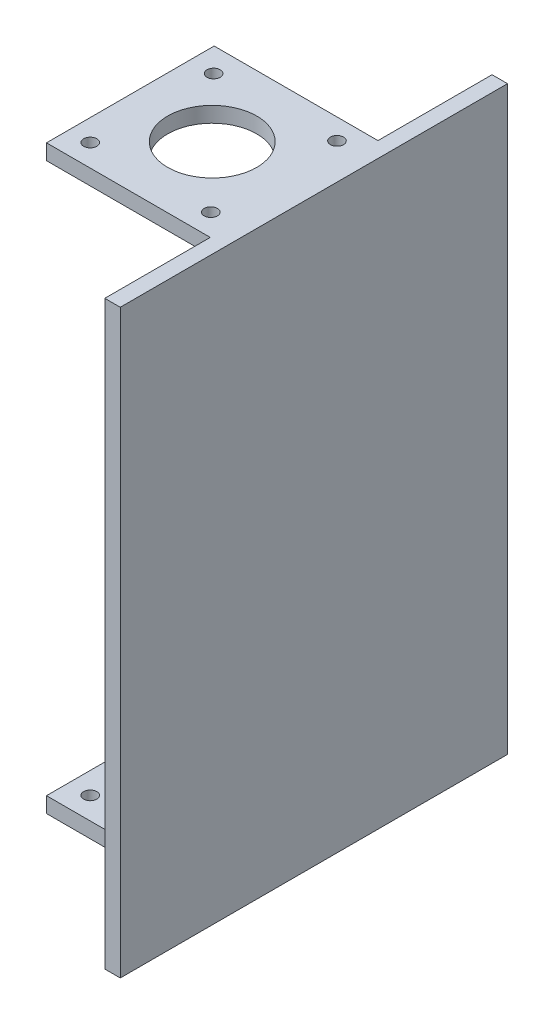
ISO-10303-21;
HEADER;
FILE_DESCRIPTION(('STEP AP214'),'2;1');
FILE_NAME('part.step','',(''),(''),'','','');
FILE_SCHEMA(('AUTOMOTIVE_DESIGN { 1 0 10303 214 1 1 1 1 }'));
ENDSEC;
DATA;
#1=APPLICATION_CONTEXT('core data for automotive mechanical design processes');
#2=APPLICATION_PROTOCOL_DEFINITION('international standard','automotive_design',2000,#1);
#3=PRODUCT_CONTEXT('',#1,'mechanical');
#4=PRODUCT('Part','Part','',(#3));
#5=PRODUCT_RELATED_PRODUCT_CATEGORY('part','',(#4));
#6=PRODUCT_DEFINITION_FORMATION('','',#4);
#7=PRODUCT_DEFINITION_CONTEXT('part definition',#1,'design');
#8=PRODUCT_DEFINITION('design','',#6,#7);
#9=PRODUCT_DEFINITION_SHAPE('','',#8);
#10=(LENGTH_UNIT() NAMED_UNIT(*) SI_UNIT(.MILLI.,.METRE.));
#11=(NAMED_UNIT(*) PLANE_ANGLE_UNIT() SI_UNIT($,.RADIAN.));
#12=(NAMED_UNIT(*) SI_UNIT($,.STERADIAN.) SOLID_ANGLE_UNIT());
#13=UNCERTAINTY_MEASURE_WITH_UNIT(LENGTH_MEASURE(1.E-05),#10,'distance_accuracy_value','');
#14=(GEOMETRIC_REPRESENTATION_CONTEXT(3) GLOBAL_UNCERTAINTY_ASSIGNED_CONTEXT((#13)) GLOBAL_UNIT_ASSIGNED_CONTEXT((#10,
#11,#12)) REPRESENTATION_CONTEXT('',''));
#15=CARTESIAN_POINT('',(0.,0.,0.));
#16=DIRECTION('',(0.,0.,1.));
#17=DIRECTION('',(1.,0.,0.));
#18=AXIS2_PLACEMENT_3D('',#15,#16,#17);
#19=CARTESIAN_POINT('',(21.15,0.,0.));
#20=DIRECTION('',(1.,0.,0.));
#21=DIRECTION('',(0.,0.,-1.));
#22=AXIS2_PLACEMENT_3D('',#19,#20,#21);
#23=PLANE('',#22);
#24=DIRECTION('',(0.,1.,0.));
#25=VECTOR('',#24,1.);
#26=CARTESIAN_POINT('',(21.15,-146.,21.65));
#27=LINE('',#26,#25);
#28=CARTESIAN_POINT('',(21.15,-146.,21.65));
#29=VERTEX_POINT('',#28);
#30=CARTESIAN_POINT('',(21.15,-142.,21.65));
#31=VERTEX_POINT('',#30);
#32=EDGE_CURVE('E146',#29,#31,#27,.T.);
#33=ORIENTED_EDGE('',*,*,#32,.F.);
#34=DIRECTION('',(0.,0.,-1.));
#35=VECTOR('',#34,1.);
#36=CARTESIAN_POINT('',(21.15,-146.,48.8941402757908));
#37=LINE('',#36,#35);
#38=CARTESIAN_POINT('',(21.15,-146.,48.8941402757908));
#39=VERTEX_POINT('',#38);
#40=EDGE_CURVE('E161',#39,#29,#37,.T.);
#41=ORIENTED_EDGE('',*,*,#40,.F.);
#42=DIRECTION('',(0.,-1.,0.));
#43=VECTOR('',#42,1.);
#44=CARTESIAN_POINT('',(21.15,4.,48.8941402757908));
#45=LINE('',#44,#43);
#46=CARTESIAN_POINT('',(21.15,4.,48.8941402757908));
#47=VERTEX_POINT('',#46);
#48=EDGE_CURVE('E167',#47,#39,#45,.T.);
#49=ORIENTED_EDGE('',*,*,#48,.F.);
#50=DIRECTION('',(0.,0.,1.));
#51=VECTOR('',#50,1.);
#52=CARTESIAN_POINT('',(21.15,4.,48.8941402757908));
#53=LINE('',#52,#51);
#54=CARTESIAN_POINT('',(21.15,4.,21.65));
#55=VERTEX_POINT('',#54);
#56=EDGE_CURVE('E177',#55,#47,#53,.T.);
#57=ORIENTED_EDGE('',*,*,#56,.F.);
#58=DIRECTION('',(0.,-1.,0.));
#59=VECTOR('',#58,1.);
#60=CARTESIAN_POINT('',(21.15,4.,21.65));
#61=LINE('',#60,#59);
#62=CARTESIAN_POINT('',(21.15,0.,21.65));
#63=VERTEX_POINT('',#62);
#64=EDGE_CURVE('E251',#55,#63,#61,.T.);
#65=ORIENTED_EDGE('',*,*,#64,.T.);
#66=DIRECTION('',(0.,0.,-1.));
#67=VECTOR('',#66,1.);
#68=CARTESIAN_POINT('',(21.15,0.,21.65));
#69=LINE('',#68,#67);
#70=CARTESIAN_POINT('',(21.15,0.,-21.65));
#71=VERTEX_POINT('',#70);
#72=EDGE_CURVE('E241',#63,#71,#69,.T.);
#73=ORIENTED_EDGE('',*,*,#72,.T.);
#74=DIRECTION('',(0.,-1.,0.));
#75=VECTOR('',#74,1.);
#76=CARTESIAN_POINT('',(21.15,4.,-21.65));
#77=LINE('',#76,#75);
#78=CARTESIAN_POINT('',(21.15,4.,-21.65));
#79=VERTEX_POINT('',#78);
#80=EDGE_CURVE('E11',#79,#71,#77,.T.);
#81=ORIENTED_EDGE('',*,*,#80,.F.);
#82=CARTESIAN_POINT('',(21.15,4.,-51.1058597242092));
#83=VERTEX_POINT('',#82);
#84=EDGE_CURVE('E184',#83,#79,#53,.T.);
#85=ORIENTED_EDGE('',*,*,#84,.F.);
#86=DIRECTION('',(0.,1.,0.));
#87=VECTOR('',#86,1.);
#88=CARTESIAN_POINT('',(21.15,4.,-51.1058597242092));
#89=LINE('',#88,#87);
#90=CARTESIAN_POINT('',(21.15,-146.,-51.1058597242093));
#91=VERTEX_POINT('',#90);
#92=EDGE_CURVE('E173',#91,#83,#89,.T.);
#93=ORIENTED_EDGE('',*,*,#92,.F.);
#94=CARTESIAN_POINT('',(21.15,-146.,-21.65));
#95=VERTEX_POINT('',#94);
#96=EDGE_CURVE('E175',#95,#91,#37,.T.);
#97=ORIENTED_EDGE('',*,*,#96,.F.);
#98=DIRECTION('',(0.,1.,0.));
#99=VECTOR('',#98,1.);
#100=CARTESIAN_POINT('',(21.15,-146.,-21.65));
#101=LINE('',#100,#99);
#102=CARTESIAN_POINT('',(21.15,-142.,-21.65));
#103=VERTEX_POINT('',#102);
#104=EDGE_CURVE('E300',#95,#103,#101,.T.);
#105=ORIENTED_EDGE('',*,*,#104,.T.);
#106=DIRECTION('',(0.,0.,-1.));
#107=VECTOR('',#106,1.);
#108=CARTESIAN_POINT('',(21.15,-142.,21.65));
#109=LINE('',#108,#107);
#110=EDGE_CURVE('E163',#31,#103,#109,.T.);
#111=ORIENTED_EDGE('',*,*,#110,.F.);
#112=EDGE_LOOP('',(#33,#41,#49,#57,#65,#73,#81,#85,#93,#97,#105,#111));
#113=FACE_BOUND('',#112,.T.);
#114=ADVANCED_FACE('F44',(#113),#23,.F.);
#115=CARTESIAN_POINT('',(0.,4.,0.));
#116=DIRECTION('',(0.,-1.,0.));
#117=DIRECTION('',(0.,0.,-1.));
#118=AXIS2_PLACEMENT_3D('',#115,#116,#117);
#119=PLANE('',#118);
#120=DIRECTION('',(1.,0.,0.));
#121=VECTOR('',#120,1.);
#122=CARTESIAN_POINT('',(-21.15,4.,21.65));
#123=LINE('',#122,#121);
#124=CARTESIAN_POINT('',(-21.15,4.,21.65));
#125=VERTEX_POINT('',#124);
#126=EDGE_CURVE('E69',#125,#55,#123,.T.);
#127=ORIENTED_EDGE('',*,*,#126,.T.);
#128=ORIENTED_EDGE('',*,*,#56,.T.);
#129=DIRECTION('',(-1.,0.,0.));
#130=VECTOR('',#129,1.);
#131=CARTESIAN_POINT('',(25.15,4.,48.8941402757908));
#132=LINE('',#131,#130);
#133=CARTESIAN_POINT('',(25.15,4.,48.8941402757908));
#134=VERTEX_POINT('',#133);
#135=EDGE_CURVE('E188',#134,#47,#132,.T.);
#136=ORIENTED_EDGE('',*,*,#135,.F.);
#137=DIRECTION('',(0.,0.,1.));
#138=VECTOR('',#137,1.);
#139=CARTESIAN_POINT('',(25.15,4.,48.8941402757908));
#140=LINE('',#139,#138);
#141=CARTESIAN_POINT('',(25.15,4.,-51.1058597242092));
#142=VERTEX_POINT('',#141);
#143=EDGE_CURVE('E192',#142,#134,#140,.T.);
#144=ORIENTED_EDGE('',*,*,#143,.F.);
#145=DIRECTION('',(-1.,0.,0.));
#146=VECTOR('',#145,1.);
#147=CARTESIAN_POINT('',(25.15,4.,-51.1058597242092));
#148=LINE('',#147,#146);
#149=EDGE_CURVE('E191',#142,#83,#148,.T.);
#150=ORIENTED_EDGE('',*,*,#149,.T.);
#151=ORIENTED_EDGE('',*,*,#84,.T.);
#152=DIRECTION('',(-1.,0.,0.));
#153=VECTOR('',#152,1.);
#154=CARTESIAN_POINT('',(-21.15,4.,-21.65));
#155=LINE('',#154,#153);
#156=CARTESIAN_POINT('',(-21.15,4.,-21.65));
#157=VERTEX_POINT('',#156);
#158=EDGE_CURVE('E96',#79,#157,#155,.T.);
#159=ORIENTED_EDGE('',*,*,#158,.T.);
#160=DIRECTION('',(0.,0.,1.));
#161=VECTOR('',#160,1.);
#162=CARTESIAN_POINT('',(-21.15,4.,21.65));
#163=LINE('',#162,#161);
#164=EDGE_CURVE('E250',#157,#125,#163,.T.);
#165=ORIENTED_EDGE('',*,*,#164,.T.);
#166=EDGE_LOOP('',(#127,#128,#136,#144,#150,#151,#159,#165));
#167=FACE_BOUND('',#166,.T.);
#168=CARTESIAN_POINT('',(-15.0693743627521,4.,-15.4256243476872));
#169=DIRECTION('',(0.,1.,0.));
#170=DIRECTION('',(0.,0.,1.));
#171=AXIS2_PLACEMENT_3D('',#168,#169,#170);
#172=CIRCLE('',#171,1.7);
#173=CARTESIAN_POINT('',(-15.0693743627521,4.,-13.7256243476872));
#174=VERTEX_POINT('',#173);
#175=EDGE_CURVE('E240',#174,#174,#172,.T.);
#176=ORIENTED_EDGE('',*,*,#175,.F.);
#177=EDGE_LOOP('',(#176));
#178=FACE_BOUND('',#177,.T.);
#179=CARTESIAN_POINT('',(15.9184393720292,4.,-16.2947618158124));
#180=DIRECTION('',(0.,1.,0.));
#181=DIRECTION('',(0.,0.,1.));
#182=AXIS2_PLACEMENT_3D('',#179,#180,#181);
#183=CIRCLE('',#182,1.7);
#184=CARTESIAN_POINT('',(15.9184393720292,4.,-14.5947618158124));
#185=VERTEX_POINT('',#184);
#186=EDGE_CURVE('E228',#185,#185,#183,.T.);
#187=ORIENTED_EDGE('',*,*,#186,.F.);
#188=EDGE_LOOP('',(#187));
#189=FACE_BOUND('',#188,.T.);
#190=CARTESIAN_POINT('',(15.5663856712265,4.,15.9343853324848));
#191=DIRECTION('',(0.,1.,0.));
#192=DIRECTION('',(0.,0.,1.));
#193=AXIS2_PLACEMENT_3D('',#190,#191,#192);
#194=CIRCLE('',#193,1.7);
#195=CARTESIAN_POINT('',(15.5663856712265,4.,17.6343853324848));
#196=VERTEX_POINT('',#195);
#197=EDGE_CURVE('E222',#196,#196,#194,.T.);
#198=ORIENTED_EDGE('',*,*,#197,.F.);
#199=EDGE_LOOP('',(#198));
#200=FACE_BOUND('',#199,.T.);
#201=CARTESIAN_POINT('',(-15.5663856712265,4.,15.9343853324848));
#202=DIRECTION('',(0.,1.,0.));
#203=DIRECTION('',(0.,0.,1.));
#204=AXIS2_PLACEMENT_3D('',#201,#202,#203);
#205=CIRCLE('',#204,1.7);
#206=CARTESIAN_POINT('',(-15.5663856712265,4.,17.6343853324848));
#207=VERTEX_POINT('',#206);
#208=EDGE_CURVE('E213',#207,#207,#205,.T.);
#209=ORIENTED_EDGE('',*,*,#208,.F.);
#210=EDGE_LOOP('',(#209));
#211=FACE_BOUND('',#210,.T.);
#212=CARTESIAN_POINT('',(0.,4.,0.));
#213=DIRECTION('',(0.,1.,0.));
#214=DIRECTION('',(0.,0.,1.));
#215=AXIS2_PLACEMENT_3D('',#212,#213,#214);
#216=CIRCLE('',#215,11.5);
#217=CARTESIAN_POINT('',(0.,4.,11.5));
#218=VERTEX_POINT('',#217);
#219=EDGE_CURVE('E202',#218,#218,#216,.T.);
#220=ORIENTED_EDGE('',*,*,#219,.F.);
#221=EDGE_LOOP('',(#220));
#222=FACE_BOUND('',#221,.T.);
#223=ADVANCED_FACE('F396',(#167,#178,#189,#200,#211,#222),#119,.F.);
#224=CARTESIAN_POINT('',(0.,0.,0.));
#225=DIRECTION('',(0.,-1.,0.));
#226=DIRECTION('',(0.,0.,-1.));
#227=AXIS2_PLACEMENT_3D('',#224,#225,#226);
#228=PLANE('',#227);
#229=CARTESIAN_POINT('',(-15.5663856712265,0.,15.9343853324848));
#230=DIRECTION('',(0.,1.,0.));
#231=DIRECTION('',(0.,0.,1.));
#232=AXIS2_PLACEMENT_3D('',#229,#230,#231);
#233=CIRCLE('',#232,1.7);
#234=CARTESIAN_POINT('',(-15.5663856712265,0.,17.6343853324848));
#235=VERTEX_POINT('',#234);
#236=EDGE_CURVE('E207',#235,#235,#233,.T.);
#237=ORIENTED_EDGE('',*,*,#236,.T.);
#238=EDGE_LOOP('',(#237));
#239=FACE_BOUND('',#238,.T.);
#240=CARTESIAN_POINT('',(15.9184393720292,0.,-16.2947618158124));
#241=DIRECTION('',(0.,1.,0.));
#242=DIRECTION('',(0.,0.,1.));
#243=AXIS2_PLACEMENT_3D('',#240,#241,#242);
#244=CIRCLE('',#243,1.7);
#245=CARTESIAN_POINT('',(15.9184393720292,0.,-14.5947618158124));
#246=VERTEX_POINT('',#245);
#247=EDGE_CURVE('E223',#246,#246,#244,.T.);
#248=ORIENTED_EDGE('',*,*,#247,.T.);
#249=EDGE_LOOP('',(#248));
#250=FACE_BOUND('',#249,.T.);
#251=ORIENTED_EDGE('',*,*,#72,.F.);
#252=DIRECTION('',(1.,0.,0.));
#253=VECTOR('',#252,1.);
#254=CARTESIAN_POINT('',(-21.15,0.,21.65));
#255=LINE('',#254,#253);
#256=CARTESIAN_POINT('',(-21.15,0.,21.65));
#257=VERTEX_POINT('',#256);
#258=EDGE_CURVE('E246',#257,#63,#255,.T.);
#259=ORIENTED_EDGE('',*,*,#258,.F.);
#260=DIRECTION('',(0.,0.,1.));
#261=VECTOR('',#260,1.);
#262=CARTESIAN_POINT('',(-21.15,0.,21.65));
#263=LINE('',#262,#261);
#264=CARTESIAN_POINT('',(-21.15,0.,-21.65));
#265=VERTEX_POINT('',#264);
#266=EDGE_CURVE('E90',#265,#257,#263,.T.);
#267=ORIENTED_EDGE('',*,*,#266,.F.);
#268=DIRECTION('',(-1.,0.,0.));
#269=VECTOR('',#268,1.);
#270=CARTESIAN_POINT('',(-21.15,0.,-21.65));
#271=LINE('',#270,#269);
#272=EDGE_CURVE('E260',#71,#265,#271,.T.);
#273=ORIENTED_EDGE('',*,*,#272,.F.);
#274=EDGE_LOOP('',(#251,#259,#267,#273));
#275=FACE_BOUND('',#274,.T.);
#276=CARTESIAN_POINT('',(-15.0693743627521,0.,-15.4256243476872));
#277=DIRECTION('',(0.,1.,0.));
#278=DIRECTION('',(0.,0.,1.));
#279=AXIS2_PLACEMENT_3D('',#276,#277,#278);
#280=CIRCLE('',#279,1.7);
#281=CARTESIAN_POINT('',(-15.0693743627521,0.,-13.7256243476872));
#282=VERTEX_POINT('',#281);
#283=EDGE_CURVE('E231',#282,#282,#280,.T.);
#284=ORIENTED_EDGE('',*,*,#283,.T.);
#285=EDGE_LOOP('',(#284));
#286=FACE_BOUND('',#285,.T.);
#287=CARTESIAN_POINT('',(15.5663856712265,0.,15.9343853324848));
#288=DIRECTION('',(0.,1.,0.));
#289=DIRECTION('',(0.,0.,1.));
#290=AXIS2_PLACEMENT_3D('',#287,#288,#289);
#291=CIRCLE('',#290,1.7);
#292=CARTESIAN_POINT('',(15.5663856712265,0.,17.6343853324848));
#293=VERTEX_POINT('',#292);
#294=EDGE_CURVE('E220',#293,#293,#291,.T.);
#295=ORIENTED_EDGE('',*,*,#294,.T.);
#296=EDGE_LOOP('',(#295));
#297=FACE_BOUND('',#296,.T.);
#298=CARTESIAN_POINT('',(0.,0.,0.));
#299=DIRECTION('',(0.,1.,0.));
#300=DIRECTION('',(0.,0.,1.));
#301=AXIS2_PLACEMENT_3D('',#298,#299,#300);
#302=CIRCLE('',#301,11.5);
#303=CARTESIAN_POINT('',(0.,0.,11.5));
#304=VERTEX_POINT('',#303);
#305=EDGE_CURVE('E204',#304,#304,#302,.T.);
#306=ORIENTED_EDGE('',*,*,#305,.T.);
#307=EDGE_LOOP('',(#306));
#308=FACE_BOUND('',#307,.T.);
#309=ADVANCED_FACE('F274',(#239,#250,#275,#286,#297,#308),#228,.T.);
#310=CARTESIAN_POINT('',(-21.15,4.,-21.65));
#311=DIRECTION('',(0.,0.,1.));
#312=DIRECTION('',(1.,0.,0.));
#313=AXIS2_PLACEMENT_3D('',#310,#311,#312);
#314=PLANE('',#313);
#315=ORIENTED_EDGE('',*,*,#272,.T.);
#316=DIRECTION('',(0.,-1.,0.));
#317=VECTOR('',#316,1.);
#318=CARTESIAN_POINT('',(-21.15,4.,-21.65));
#319=LINE('',#318,#317);
#320=EDGE_CURVE('E53',#157,#265,#319,.T.);
#321=ORIENTED_EDGE('',*,*,#320,.F.);
#322=ORIENTED_EDGE('',*,*,#158,.F.);
#323=ORIENTED_EDGE('',*,*,#80,.T.);
#324=EDGE_LOOP('',(#315,#321,#322,#323));
#325=FACE_BOUND('',#324,.T.);
#326=ADVANCED_FACE('F50',(#325),#314,.F.);
#327=CARTESIAN_POINT('',(-21.15,4.,21.65));
#328=DIRECTION('',(1.,0.,0.));
#329=DIRECTION('',(0.,0.,-1.));
#330=AXIS2_PLACEMENT_3D('',#327,#328,#329);
#331=PLANE('',#330);
#332=ORIENTED_EDGE('',*,*,#266,.T.);
#333=DIRECTION('',(0.,-1.,0.));
#334=VECTOR('',#333,1.);
#335=CARTESIAN_POINT('',(-21.15,4.,21.65));
#336=LINE('',#335,#334);
#337=EDGE_CURVE('E268',#125,#257,#336,.T.);
#338=ORIENTED_EDGE('',*,*,#337,.F.);
#339=ORIENTED_EDGE('',*,*,#164,.F.);
#340=ORIENTED_EDGE('',*,*,#320,.T.);
#341=EDGE_LOOP('',(#332,#338,#339,#340));
#342=FACE_BOUND('',#341,.T.);
#343=ADVANCED_FACE('F275',(#342),#331,.F.);
#344=CARTESIAN_POINT('',(-21.15,4.,21.65));
#345=DIRECTION('',(0.,0.,-1.));
#346=DIRECTION('',(-1.,0.,0.));
#347=AXIS2_PLACEMENT_3D('',#344,#345,#346);
#348=PLANE('',#347);
#349=ORIENTED_EDGE('',*,*,#258,.T.);
#350=ORIENTED_EDGE('',*,*,#64,.F.);
#351=ORIENTED_EDGE('',*,*,#126,.F.);
#352=ORIENTED_EDGE('',*,*,#337,.T.);
#353=EDGE_LOOP('',(#349,#350,#351,#352));
#354=FACE_BOUND('',#353,.T.);
#355=ADVANCED_FACE('F279',(#354),#348,.F.);
#356=CARTESIAN_POINT('',(-15.0693743627521,4.,-15.4256243476872));
#357=DIRECTION('',(0.,-1.,0.));
#358=DIRECTION('',(0.,0.,-1.));
#359=AXIS2_PLACEMENT_3D('',#356,#357,#358);
#360=CYLINDRICAL_SURFACE('',#359,1.7);
#361=ORIENTED_EDGE('',*,*,#175,.T.);
#362=EDGE_LOOP('',(#361));
#363=FACE_BOUND('',#362,.T.);
#364=ORIENTED_EDGE('',*,*,#283,.F.);
#365=EDGE_LOOP('',(#364));
#366=FACE_BOUND('',#365,.T.);
#367=ADVANCED_FACE('F438',(#363,#366),#360,.F.);
#368=CARTESIAN_POINT('',(15.9184393720292,4.,-16.2947618158124));
#369=DIRECTION('',(0.,-1.,0.));
#370=DIRECTION('',(0.,0.,-1.));
#371=AXIS2_PLACEMENT_3D('',#368,#369,#370);
#372=CYLINDRICAL_SURFACE('',#371,1.7);
#373=ORIENTED_EDGE('',*,*,#186,.T.);
#374=EDGE_LOOP('',(#373));
#375=FACE_BOUND('',#374,.T.);
#376=ORIENTED_EDGE('',*,*,#247,.F.);
#377=EDGE_LOOP('',(#376));
#378=FACE_BOUND('',#377,.T.);
#379=ADVANCED_FACE('F434',(#375,#378),#372,.F.);
#380=CARTESIAN_POINT('',(15.5663856712265,4.,15.9343853324848));
#381=DIRECTION('',(0.,-1.,0.));
#382=DIRECTION('',(0.,0.,-1.));
#383=AXIS2_PLACEMENT_3D('',#380,#381,#382);
#384=CYLINDRICAL_SURFACE('',#383,1.7);
#385=ORIENTED_EDGE('',*,*,#197,.T.);
#386=EDGE_LOOP('',(#385));
#387=FACE_BOUND('',#386,.T.);
#388=ORIENTED_EDGE('',*,*,#294,.F.);
#389=EDGE_LOOP('',(#388));
#390=FACE_BOUND('',#389,.T.);
#391=ADVANCED_FACE('F431',(#387,#390),#384,.F.);
#392=CARTESIAN_POINT('',(-15.5663856712265,4.,15.9343853324848));
#393=DIRECTION('',(0.,-1.,0.));
#394=DIRECTION('',(0.,0.,-1.));
#395=AXIS2_PLACEMENT_3D('',#392,#393,#394);
#396=CYLINDRICAL_SURFACE('',#395,1.7);
#397=ORIENTED_EDGE('',*,*,#208,.T.);
#398=EDGE_LOOP('',(#397));
#399=FACE_BOUND('',#398,.T.);
#400=ORIENTED_EDGE('',*,*,#236,.F.);
#401=EDGE_LOOP('',(#400));
#402=FACE_BOUND('',#401,.T.);
#403=ADVANCED_FACE('F430',(#399,#402),#396,.F.);
#404=CARTESIAN_POINT('',(0.,4.,0.));
#405=DIRECTION('',(0.,-1.,0.));
#406=DIRECTION('',(0.,0.,-1.));
#407=AXIS2_PLACEMENT_3D('',#404,#405,#406);
#408=CYLINDRICAL_SURFACE('',#407,11.5);
#409=ORIENTED_EDGE('',*,*,#219,.T.);
#410=EDGE_LOOP('',(#409));
#411=FACE_BOUND('',#410,.T.);
#412=ORIENTED_EDGE('',*,*,#305,.F.);
#413=EDGE_LOOP('',(#412));
#414=FACE_BOUND('',#413,.T.);
#415=ADVANCED_FACE('F424',(#411,#414),#408,.F.);
#416=CARTESIAN_POINT('',(25.15,4.,48.8941402757908));
#417=DIRECTION('',(0.,0.,-1.));
#418=DIRECTION('',(0.,1.,0.));
#419=AXIS2_PLACEMENT_3D('',#416,#417,#418);
#420=PLANE('',#419);
#421=ORIENTED_EDGE('',*,*,#48,.T.);
#422=DIRECTION('',(-1.,0.,0.));
#423=VECTOR('',#422,1.);
#424=CARTESIAN_POINT('',(25.15,-146.,48.8941402757908));
#425=LINE('',#424,#423);
#426=CARTESIAN_POINT('',(25.15,-146.,48.8941402757908));
#427=VERTEX_POINT('',#426);
#428=EDGE_CURVE('E171',#427,#39,#425,.T.);
#429=ORIENTED_EDGE('',*,*,#428,.F.);
#430=DIRECTION('',(0.,-1.,0.));
#431=VECTOR('',#430,1.);
#432=CARTESIAN_POINT('',(25.15,4.,48.8941402757908));
#433=LINE('',#432,#431);
#434=EDGE_CURVE('E189',#134,#427,#433,.T.);
#435=ORIENTED_EDGE('',*,*,#434,.F.);
#436=ORIENTED_EDGE('',*,*,#135,.T.);
#437=EDGE_LOOP('',(#421,#429,#435,#436));
#438=FACE_BOUND('',#437,.T.);
#439=ADVANCED_FACE('F398',(#438),#420,.F.);
#440=CARTESIAN_POINT('',(25.15,-146.,48.8941402757908));
#441=DIRECTION('',(0.,1.,0.));
#442=DIRECTION('',(0.,0.,1.));
#443=AXIS2_PLACEMENT_3D('',#440,#441,#442);
#444=PLANE('',#443);
#445=ORIENTED_EDGE('',*,*,#40,.T.);
#446=DIRECTION('',(1.,0.,0.));
#447=VECTOR('',#446,1.);
#448=CARTESIAN_POINT('',(-21.15,-146.,21.65));
#449=LINE('',#448,#447);
#450=CARTESIAN_POINT('',(-21.15,-146.,21.65));
#451=VERTEX_POINT('',#450);
#452=EDGE_CURVE('E144',#451,#29,#449,.T.);
#453=ORIENTED_EDGE('',*,*,#452,.F.);
#454=DIRECTION('',(0.,0.,1.));
#455=VECTOR('',#454,1.);
#456=CARTESIAN_POINT('',(-21.15,-146.,21.65));
#457=LINE('',#456,#455);
#458=CARTESIAN_POINT('',(-21.15,-146.,-21.65));
#459=VERTEX_POINT('',#458);
#460=EDGE_CURVE('E156',#459,#451,#457,.T.);
#461=ORIENTED_EDGE('',*,*,#460,.F.);
#462=DIRECTION('',(-1.,0.,0.));
#463=VECTOR('',#462,1.);
#464=CARTESIAN_POINT('',(-21.15,-146.,-21.65));
#465=LINE('',#464,#463);
#466=EDGE_CURVE('E301',#95,#459,#465,.T.);
#467=ORIENTED_EDGE('',*,*,#466,.F.);
#468=ORIENTED_EDGE('',*,*,#96,.T.);
#469=DIRECTION('',(-1.,0.,0.));
#470=VECTOR('',#469,1.);
#471=CARTESIAN_POINT('',(25.15,-146.,-51.1058597242093));
#472=LINE('',#471,#470);
#473=CARTESIAN_POINT('',(25.15,-146.,-51.1058597242093));
#474=VERTEX_POINT('',#473);
#475=EDGE_CURVE('E196',#474,#91,#472,.T.);
#476=ORIENTED_EDGE('',*,*,#475,.F.);
#477=DIRECTION('',(0.,0.,-1.));
#478=VECTOR('',#477,1.);
#479=CARTESIAN_POINT('',(25.15,-146.,48.8941402757908));
#480=LINE('',#479,#478);
#481=EDGE_CURVE('E285',#427,#474,#480,.T.);
#482=ORIENTED_EDGE('',*,*,#481,.F.);
#483=ORIENTED_EDGE('',*,*,#428,.T.);
#484=EDGE_LOOP('',(#445,#453,#461,#467,#468,#476,#482,#483));
#485=FACE_BOUND('',#484,.T.);
#486=CARTESIAN_POINT('',(0.,-146.,0.));
#487=DIRECTION('',(0.,1.,0.));
#488=DIRECTION('',(0.,0.,1.));
#489=AXIS2_PLACEMENT_3D('',#486,#487,#488);
#490=CIRCLE('',#489,11.5);
#491=CARTESIAN_POINT('',(0.,-146.,11.5));
#492=VERTEX_POINT('',#491);
#493=EDGE_CURVE('E346',#492,#492,#490,.T.);
#494=ORIENTED_EDGE('',*,*,#493,.T.);
#495=EDGE_LOOP('',(#494));
#496=FACE_BOUND('',#495,.T.);
#497=CARTESIAN_POINT('',(-15.5663856712265,-146.,15.9343853324848));
#498=DIRECTION('',(0.,1.,0.));
#499=DIRECTION('',(0.,0.,1.));
#500=AXIS2_PLACEMENT_3D('',#497,#498,#499);
#501=CIRCLE('',#500,1.7);
#502=CARTESIAN_POINT('',(-15.5663856712265,-146.,17.6343853324848));
#503=VERTEX_POINT('',#502);
#504=EDGE_CURVE('E340',#503,#503,#501,.T.);
#505=ORIENTED_EDGE('',*,*,#504,.T.);
#506=EDGE_LOOP('',(#505));
#507=FACE_BOUND('',#506,.T.);
#508=CARTESIAN_POINT('',(15.5663856712265,-146.,15.9343853324848));
#509=DIRECTION('',(0.,1.,0.));
#510=DIRECTION('',(0.,0.,1.));
#511=AXIS2_PLACEMENT_3D('',#508,#509,#510);
#512=CIRCLE('',#511,1.7);
#513=CARTESIAN_POINT('',(15.5663856712265,-146.,17.6343853324848));
#514=VERTEX_POINT('',#513);
#515=EDGE_CURVE('E335',#514,#514,#512,.T.);
#516=ORIENTED_EDGE('',*,*,#515,.T.);
#517=EDGE_LOOP('',(#516));
#518=FACE_BOUND('',#517,.T.);
#519=CARTESIAN_POINT('',(15.9184393720292,-146.,-16.2947618158124));
#520=DIRECTION('',(0.,1.,0.));
#521=DIRECTION('',(0.,0.,1.));
#522=AXIS2_PLACEMENT_3D('',#519,#520,#521);
#523=CIRCLE('',#522,1.7);
#524=CARTESIAN_POINT('',(15.9184393720292,-146.,-14.5947618158124));
#525=VERTEX_POINT('',#524);
#526=EDGE_CURVE('E322',#525,#525,#523,.T.);
#527=ORIENTED_EDGE('',*,*,#526,.T.);
#528=EDGE_LOOP('',(#527));
#529=FACE_BOUND('',#528,.T.);
#530=CARTESIAN_POINT('',(-15.0693743627521,-146.,-15.4256243476872));
#531=DIRECTION('',(0.,1.,0.));
#532=DIRECTION('',(0.,0.,1.));
#533=AXIS2_PLACEMENT_3D('',#530,#531,#532);
#534=CIRCLE('',#533,1.7);
#535=CARTESIAN_POINT('',(-15.0693743627521,-146.,-13.7256243476872));
#536=VERTEX_POINT('',#535);
#537=EDGE_CURVE('E314',#536,#536,#534,.T.);
#538=ORIENTED_EDGE('',*,*,#537,.T.);
#539=EDGE_LOOP('',(#538));
#540=FACE_BOUND('',#539,.T.);
#541=ADVANCED_FACE('F169',(#485,#496,#507,#518,#529,#540),#444,.F.);
#542=CARTESIAN_POINT('',(25.15,4.,-51.1058597242092));
#543=DIRECTION('',(0.,0.,1.));
#544=DIRECTION('',(0.,-1.,0.));
#545=AXIS2_PLACEMENT_3D('',#542,#543,#544);
#546=PLANE('',#545);
#547=ORIENTED_EDGE('',*,*,#92,.T.);
#548=ORIENTED_EDGE('',*,*,#149,.F.);
#549=DIRECTION('',(0.,1.,0.));
#550=VECTOR('',#549,1.);
#551=CARTESIAN_POINT('',(25.15,4.,-51.1058597242092));
#552=LINE('',#551,#550);
#553=EDGE_CURVE('E286',#474,#142,#552,.T.);
#554=ORIENTED_EDGE('',*,*,#553,.F.);
#555=ORIENTED_EDGE('',*,*,#475,.T.);
#556=EDGE_LOOP('',(#547,#548,#554,#555));
#557=FACE_BOUND('',#556,.T.);
#558=ADVANCED_FACE('F391',(#557),#546,.F.);
#559=CARTESIAN_POINT('',(25.15,0.,0.));
#560=DIRECTION('',(1.,0.,0.));
#561=DIRECTION('',(0.,0.,-1.));
#562=AXIS2_PLACEMENT_3D('',#559,#560,#561);
#563=PLANE('',#562);
#564=ORIENTED_EDGE('',*,*,#434,.T.);
#565=ORIENTED_EDGE('',*,*,#481,.T.);
#566=ORIENTED_EDGE('',*,*,#553,.T.);
#567=ORIENTED_EDGE('',*,*,#143,.T.);
#568=EDGE_LOOP('',(#564,#565,#566,#567));
#569=FACE_BOUND('',#568,.T.);
#570=ADVANCED_FACE('F394',(#569),#563,.T.);
#571=CARTESIAN_POINT('',(-21.15,-146.,21.65));
#572=DIRECTION('',(0.,0.,1.));
#573=DIRECTION('',(1.,0.,0.));
#574=AXIS2_PLACEMENT_3D('',#571,#572,#573);
#575=PLANE('',#574);
#576=DIRECTION('',(1.,0.,0.));
#577=VECTOR('',#576,1.);
#578=CARTESIAN_POINT('',(-21.15,-142.,21.65));
#579=LINE('',#578,#577);
#580=CARTESIAN_POINT('',(-21.15,-142.,21.65));
#581=VERTEX_POINT('',#580);
#582=EDGE_CURVE('E61',#581,#31,#579,.T.);
#583=ORIENTED_EDGE('',*,*,#582,.F.);
#584=DIRECTION('',(0.,1.,0.));
#585=VECTOR('',#584,1.);
#586=CARTESIAN_POINT('',(-21.15,-146.,21.65));
#587=LINE('',#586,#585);
#588=EDGE_CURVE('E147',#451,#581,#587,.T.);
#589=ORIENTED_EDGE('',*,*,#588,.F.);
#590=ORIENTED_EDGE('',*,*,#452,.T.);
#591=ORIENTED_EDGE('',*,*,#32,.T.);
#592=EDGE_LOOP('',(#583,#589,#590,#591));
#593=FACE_BOUND('',#592,.T.);
#594=ADVANCED_FACE('F150',(#593),#575,.T.);
#595=CARTESIAN_POINT('',(-21.15,-146.,21.65));
#596=DIRECTION('',(-1.,0.,0.));
#597=DIRECTION('',(0.,0.,1.));
#598=AXIS2_PLACEMENT_3D('',#595,#596,#597);
#599=PLANE('',#598);
#600=DIRECTION('',(0.,0.,1.));
#601=VECTOR('',#600,1.);
#602=CARTESIAN_POINT('',(-21.15,-142.,21.65));
#603=LINE('',#602,#601);
#604=CARTESIAN_POINT('',(-21.15,-142.,-21.65));
#605=VERTEX_POINT('',#604);
#606=EDGE_CURVE('E307',#605,#581,#603,.T.);
#607=ORIENTED_EDGE('',*,*,#606,.F.);
#608=DIRECTION('',(0.,1.,0.));
#609=VECTOR('',#608,1.);
#610=CARTESIAN_POINT('',(-21.15,-146.,-21.65));
#611=LINE('',#610,#609);
#612=EDGE_CURVE('E297',#459,#605,#611,.T.);
#613=ORIENTED_EDGE('',*,*,#612,.F.);
#614=ORIENTED_EDGE('',*,*,#460,.T.);
#615=ORIENTED_EDGE('',*,*,#588,.T.);
#616=EDGE_LOOP('',(#607,#613,#614,#615));
#617=FACE_BOUND('',#616,.T.);
#618=ADVANCED_FACE('F486',(#617),#599,.T.);
#619=CARTESIAN_POINT('',(-21.15,-146.,-21.65));
#620=DIRECTION('',(0.,0.,-1.));
#621=DIRECTION('',(-1.,0.,0.));
#622=AXIS2_PLACEMENT_3D('',#619,#620,#621);
#623=PLANE('',#622);
#624=DIRECTION('',(-1.,0.,0.));
#625=VECTOR('',#624,1.);
#626=CARTESIAN_POINT('',(-21.15,-142.,-21.65));
#627=LINE('',#626,#625);
#628=EDGE_CURVE('E160',#103,#605,#627,.T.);
#629=ORIENTED_EDGE('',*,*,#628,.F.);
#630=ORIENTED_EDGE('',*,*,#104,.F.);
#631=ORIENTED_EDGE('',*,*,#466,.T.);
#632=ORIENTED_EDGE('',*,*,#612,.T.);
#633=EDGE_LOOP('',(#629,#630,#631,#632));
#634=FACE_BOUND('',#633,.T.);
#635=ADVANCED_FACE('F375',(#634),#623,.T.);
#636=CARTESIAN_POINT('',(0.,-142.,0.));
#637=DIRECTION('',(0.,1.,0.));
#638=DIRECTION('',(0.,0.,-1.));
#639=AXIS2_PLACEMENT_3D('',#636,#637,#638);
#640=PLANE('',#639);
#641=CARTESIAN_POINT('',(0.,-142.,0.));
#642=DIRECTION('',(0.,1.,0.));
#643=DIRECTION('',(0.,0.,1.));
#644=AXIS2_PLACEMENT_3D('',#641,#642,#643);
#645=CIRCLE('',#644,11.5);
#646=CARTESIAN_POINT('',(0.,-142.,11.5));
#647=VERTEX_POINT('',#646);
#648=EDGE_CURVE('E352',#647,#647,#645,.T.);
#649=ORIENTED_EDGE('',*,*,#648,.F.);
#650=EDGE_LOOP('',(#649));
#651=FACE_BOUND('',#650,.T.);
#652=CARTESIAN_POINT('',(-15.5663856712265,-142.,15.9343853324848));
#653=DIRECTION('',(0.,1.,0.));
#654=DIRECTION('',(0.,0.,1.));
#655=AXIS2_PLACEMENT_3D('',#652,#653,#654);
#656=CIRCLE('',#655,1.7);
#657=CARTESIAN_POINT('',(-15.5663856712265,-142.,17.6343853324848));
#658=VERTEX_POINT('',#657);
#659=EDGE_CURVE('E342',#658,#658,#656,.T.);
#660=ORIENTED_EDGE('',*,*,#659,.F.);
#661=EDGE_LOOP('',(#660));
#662=FACE_BOUND('',#661,.T.);
#663=CARTESIAN_POINT('',(15.5663856712265,-142.,15.9343853324848));
#664=DIRECTION('',(0.,1.,0.));
#665=DIRECTION('',(0.,0.,1.));
#666=AXIS2_PLACEMENT_3D('',#663,#664,#665);
#667=CIRCLE('',#666,1.7);
#668=CARTESIAN_POINT('',(15.5663856712265,-142.,17.6343853324848));
#669=VERTEX_POINT('',#668);
#670=EDGE_CURVE('E336',#669,#669,#667,.T.);
#671=ORIENTED_EDGE('',*,*,#670,.F.);
#672=EDGE_LOOP('',(#671));
#673=FACE_BOUND('',#672,.T.);
#674=CARTESIAN_POINT('',(15.9184393720292,-142.,-16.2947618158124));
#675=DIRECTION('',(0.,1.,0.));
#676=DIRECTION('',(0.,0.,1.));
#677=AXIS2_PLACEMENT_3D('',#674,#675,#676);
#678=CIRCLE('',#677,1.7);
#679=CARTESIAN_POINT('',(15.9184393720292,-142.,-14.5947618158124));
#680=VERTEX_POINT('',#679);
#681=EDGE_CURVE('E327',#680,#680,#678,.T.);
#682=ORIENTED_EDGE('',*,*,#681,.F.);
#683=EDGE_LOOP('',(#682));
#684=FACE_BOUND('',#683,.T.);
#685=CARTESIAN_POINT('',(-15.0693743627521,-142.,-15.4256243476872));
#686=DIRECTION('',(0.,1.,0.));
#687=DIRECTION('',(0.,0.,1.));
#688=AXIS2_PLACEMENT_3D('',#685,#686,#687);
#689=CIRCLE('',#688,1.7);
#690=CARTESIAN_POINT('',(-15.0693743627521,-142.,-13.7256243476872));
#691=VERTEX_POINT('',#690);
#692=EDGE_CURVE('E319',#691,#691,#689,.T.);
#693=ORIENTED_EDGE('',*,*,#692,.F.);
#694=EDGE_LOOP('',(#693));
#695=FACE_BOUND('',#694,.T.);
#696=ORIENTED_EDGE('',*,*,#110,.T.);
#697=ORIENTED_EDGE('',*,*,#628,.T.);
#698=ORIENTED_EDGE('',*,*,#606,.T.);
#699=ORIENTED_EDGE('',*,*,#582,.T.);
#700=EDGE_LOOP('',(#696,#697,#698,#699));
#701=FACE_BOUND('',#700,.T.);
#702=ADVANCED_FACE('F366',(#651,#662,#673,#684,#695,#701),#640,.T.);
#703=CARTESIAN_POINT('',(-15.0693743627521,-146.,-15.4256243476872));
#704=DIRECTION('',(0.,1.,0.));
#705=DIRECTION('',(0.,0.,1.));
#706=AXIS2_PLACEMENT_3D('',#703,#704,#705);
#707=CYLINDRICAL_SURFACE('',#706,1.7);
#708=ORIENTED_EDGE('',*,*,#537,.F.);
#709=EDGE_LOOP('',(#708));
#710=FACE_BOUND('',#709,.T.);
#711=ORIENTED_EDGE('',*,*,#692,.T.);
#712=EDGE_LOOP('',(#711));
#713=FACE_BOUND('',#712,.T.);
#714=ADVANCED_FACE('F371',(#710,#713),#707,.F.);
#715=CARTESIAN_POINT('',(15.9184393720292,-146.,-16.2947618158124));
#716=DIRECTION('',(0.,1.,0.));
#717=DIRECTION('',(0.,0.,1.));
#718=AXIS2_PLACEMENT_3D('',#715,#716,#717);
#719=CYLINDRICAL_SURFACE('',#718,1.7);
#720=ORIENTED_EDGE('',*,*,#526,.F.);
#721=EDGE_LOOP('',(#720));
#722=FACE_BOUND('',#721,.T.);
#723=ORIENTED_EDGE('',*,*,#681,.T.);
#724=EDGE_LOOP('',(#723));
#725=FACE_BOUND('',#724,.T.);
#726=ADVANCED_FACE('F517',(#722,#725),#719,.F.);
#727=CARTESIAN_POINT('',(15.5663856712265,-146.,15.9343853324848));
#728=DIRECTION('',(0.,1.,0.));
#729=DIRECTION('',(0.,0.,1.));
#730=AXIS2_PLACEMENT_3D('',#727,#728,#729);
#731=CYLINDRICAL_SURFACE('',#730,1.7);
#732=ORIENTED_EDGE('',*,*,#515,.F.);
#733=EDGE_LOOP('',(#732));
#734=FACE_BOUND('',#733,.T.);
#735=ORIENTED_EDGE('',*,*,#670,.T.);
#736=EDGE_LOOP('',(#735));
#737=FACE_BOUND('',#736,.T.);
#738=ADVANCED_FACE('F527',(#734,#737),#731,.F.);
#739=CARTESIAN_POINT('',(-15.5663856712265,-146.,15.9343853324848));
#740=DIRECTION('',(0.,1.,0.));
#741=DIRECTION('',(0.,0.,1.));
#742=AXIS2_PLACEMENT_3D('',#739,#740,#741);
#743=CYLINDRICAL_SURFACE('',#742,1.7);
#744=ORIENTED_EDGE('',*,*,#504,.F.);
#745=EDGE_LOOP('',(#744));
#746=FACE_BOUND('',#745,.T.);
#747=ORIENTED_EDGE('',*,*,#659,.T.);
#748=EDGE_LOOP('',(#747));
#749=FACE_BOUND('',#748,.T.);
#750=ADVANCED_FACE('F365',(#746,#749),#743,.F.);
#751=CARTESIAN_POINT('',(0.,-146.,0.));
#752=DIRECTION('',(0.,1.,0.));
#753=DIRECTION('',(0.,0.,1.));
#754=AXIS2_PLACEMENT_3D('',#751,#752,#753);
#755=CYLINDRICAL_SURFACE('',#754,11.5);
#756=ORIENTED_EDGE('',*,*,#493,.F.);
#757=EDGE_LOOP('',(#756));
#758=FACE_BOUND('',#757,.T.);
#759=ORIENTED_EDGE('',*,*,#648,.T.);
#760=EDGE_LOOP('',(#759));
#761=FACE_BOUND('',#760,.T.);
#762=ADVANCED_FACE('F363',(#758,#761),#755,.F.);
#763=CLOSED_SHELL('',(#114,#223,#309,#326,#343,#355,#367,#379,#391,#403,#415,#439,#541,#558,
#570,#594,#618,#635,#702,#714,#726,#738,#750,#762));
#764=MANIFOLD_SOLID_BREP('B2',#763);
#765=ADVANCED_BREP_SHAPE_REPRESENTATION('',(#18,#764),#14);
#766=SHAPE_DEFINITION_REPRESENTATION(#9,#765);
ENDSEC;
END-ISO-10303-21;
